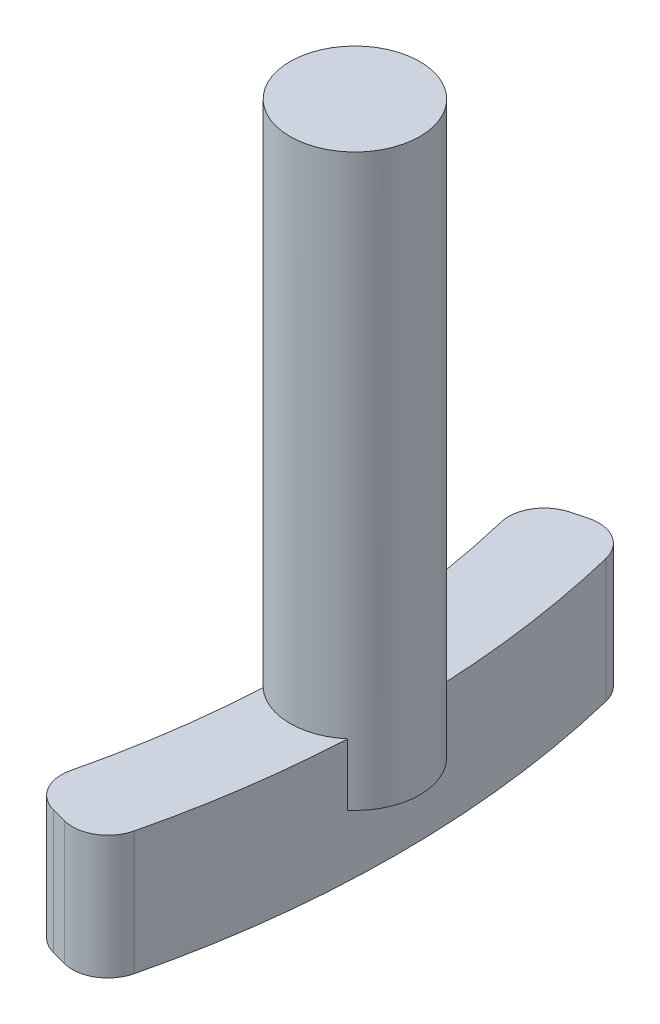
ISO-10303-21;
HEADER;
FILE_DESCRIPTION(('STEP AP214'),'2;1');
FILE_NAME('part.step','',(''),(''),'','','');
FILE_SCHEMA(('AUTOMOTIVE_DESIGN { 1 0 10303 214 1 1 1 1 }'));
ENDSEC;
DATA;
#1=APPLICATION_CONTEXT('core data for automotive mechanical design processes');
#2=APPLICATION_PROTOCOL_DEFINITION('international standard','automotive_design',2000,#1);
#3=PRODUCT_CONTEXT('',#1,'mechanical');
#4=PRODUCT('Part','Part','',(#3));
#5=PRODUCT_RELATED_PRODUCT_CATEGORY('part','',(#4));
#6=PRODUCT_DEFINITION_FORMATION('','',#4);
#7=PRODUCT_DEFINITION_CONTEXT('part definition',#1,'design');
#8=PRODUCT_DEFINITION('design','',#6,#7);
#9=PRODUCT_DEFINITION_SHAPE('','',#8);
#10=(LENGTH_UNIT() NAMED_UNIT(*) SI_UNIT(.MILLI.,.METRE.));
#11=(NAMED_UNIT(*) PLANE_ANGLE_UNIT() SI_UNIT($,.RADIAN.));
#12=(NAMED_UNIT(*) SI_UNIT($,.STERADIAN.) SOLID_ANGLE_UNIT());
#13=UNCERTAINTY_MEASURE_WITH_UNIT(LENGTH_MEASURE(1.E-05),#10,'distance_accuracy_value','');
#14=(GEOMETRIC_REPRESENTATION_CONTEXT(3) GLOBAL_UNCERTAINTY_ASSIGNED_CONTEXT((#13)) GLOBAL_UNIT_ASSIGNED_CONTEXT((#10,
#11,#12)) REPRESENTATION_CONTEXT('',''));
#15=CARTESIAN_POINT('',(0.,0.,0.));
#16=DIRECTION('',(0.,0.,1.));
#17=DIRECTION('',(1.,0.,0.));
#18=AXIS2_PLACEMENT_3D('',#15,#16,#17);
#19=CARTESIAN_POINT('',(-30.5687487202427,4.,-6.82173660494919E-13));
#20=DIRECTION('',(0.,-1.,0.));
#21=DIRECTION('',(0.,0.,-1.));
#22=AXIS2_PLACEMENT_3D('',#19,#20,#21);
#23=CYLINDRICAL_SURFACE('',#22,32.3999999999997);
#24=DIRECTION('',(0.,-1.,0.));
#25=VECTOR('',#24,1.);
#26=CARTESIAN_POINT('',(1.79173515072469,11.22,1.59971361088078));
#27=LINE('',#26,#25);
#28=CARTESIAN_POINT('',(1.79173515072469,4.,1.59971361088077));
#29=VERTEX_POINT('',#28);
#30=CARTESIAN_POINT('',(1.79173515072469,2.,1.59971361088078));
#31=VERTEX_POINT('',#30);
#32=EDGE_CURVE('E201',#29,#31,#27,.T.);
#33=ORIENTED_EDGE('',*,*,#32,.F.);
#34=CARTESIAN_POINT('',(-30.5687487202427,4.,-6.82173660494919E-13));
#35=DIRECTION('',(0.,1.,0.));
#36=DIRECTION('',(0.,0.,1.));
#37=AXIS2_PLACEMENT_3D('',#34,#35,#36);
#38=CIRCLE('',#37,32.3999999999997);
#39=CARTESIAN_POINT('',(0.919491195643052,4.,7.63221769864987));
#40=VERTEX_POINT('',#39);
#41=EDGE_CURVE('E190',#40,#29,#38,.T.);
#42=ORIENTED_EDGE('',*,*,#41,.F.);
#43=DIRECTION('',(0.,-1.,0.));
#44=VECTOR('',#43,1.);
#45=CARTESIAN_POINT('',(0.919491195643052,4.,7.63221769864987));
#46=LINE('',#45,#44);
#47=CARTESIAN_POINT('',(0.919491195643052,0.,7.63221769864987));
#48=VERTEX_POINT('',#47);
#49=EDGE_CURVE('E151',#40,#48,#46,.T.);
#50=ORIENTED_EDGE('',*,*,#49,.T.);
#51=CARTESIAN_POINT('',(-30.5687487202427,0.,-6.82173660494919E-13));
#52=DIRECTION('',(0.,1.,0.));
#53=DIRECTION('',(0.,0.,1.));
#54=AXIS2_PLACEMENT_3D('',#51,#52,#53);
#55=CIRCLE('',#54,32.3999999999997);
#56=CARTESIAN_POINT('',(0.919491195642906,0.,-7.63221769865215));
#57=VERTEX_POINT('',#56);
#58=EDGE_CURVE('E176',#48,#57,#55,.T.);
#59=ORIENTED_EDGE('',*,*,#58,.T.);
#60=DIRECTION('',(0.,-1.,0.));
#61=VECTOR('',#60,1.);
#62=CARTESIAN_POINT('',(0.919491195642906,4.,-7.63221769865215));
#63=LINE('',#62,#61);
#64=CARTESIAN_POINT('',(0.919491195642906,4.,-7.63221769865215));
#65=VERTEX_POINT('',#64);
#66=EDGE_CURVE('E154',#65,#57,#63,.T.);
#67=ORIENTED_EDGE('',*,*,#66,.F.);
#68=CARTESIAN_POINT('',(1.79173515072477,4.,-1.59971361088071));
#69=VERTEX_POINT('',#68);
#70=EDGE_CURVE('E193',#69,#65,#38,.T.);
#71=ORIENTED_EDGE('',*,*,#70,.F.);
#72=DIRECTION('',(0.,-1.,0.));
#73=VECTOR('',#72,1.);
#74=CARTESIAN_POINT('',(1.79173515072477,11.22,-1.59971361088071));
#75=LINE('',#74,#73);
#76=CARTESIAN_POINT('',(1.79173515072476,2.,-1.59971361088072));
#77=VERTEX_POINT('',#76);
#78=EDGE_CURVE('E48',#77,#69,#75,.F.);
#79=ORIENTED_EDGE('',*,*,#78,.F.);
#80=CARTESIAN_POINT('',(-30.5687487202427,2.,-6.82173660494919E-13));
#81=DIRECTION('',(0.,1.,0.));
#82=DIRECTION('',(0.,0.,1.));
#83=AXIS2_PLACEMENT_3D('',#80,#81,#82);
#84=CIRCLE('',#83,32.3999999999997);
#85=EDGE_CURVE('E52',#31,#77,#84,.T.);
#86=ORIENTED_EDGE('',*,*,#85,.F.);
#87=EDGE_LOOP('',(#33,#42,#50,#59,#67,#71,#79,#86));
#88=FACE_BOUND('',#87,.T.);
#89=ADVANCED_FACE('F33',(#88),#23,.T.);
#90=CARTESIAN_POINT('',(-30.5687487202427,4.,-6.82173660494919E-13));
#91=DIRECTION('',(0.,-1.,0.));
#92=DIRECTION('',(0.,0.,-1.));
#93=AXIS2_PLACEMENT_3D('',#90,#91,#92);
#94=CYLINDRICAL_SURFACE('',#93,29.5999999999999);
#95=DIRECTION('',(0.,-1.,0.));
#96=VECTOR('',#95,1.);
#97=CARTESIAN_POINT('',(-1.00826484927511,11.22,1.52898440615198));
#98=LINE('',#97,#96);
#99=CARTESIAN_POINT('',(-1.00826484927514,2.,1.52898440615195));
#100=VERTEX_POINT('',#99);
#101=CARTESIAN_POINT('',(-1.00826484927514,4.,1.52898440615202));
#102=VERTEX_POINT('',#101);
#103=EDGE_CURVE('E203',#100,#102,#98,.F.);
#104=ORIENTED_EDGE('',*,*,#103,.F.);
#105=CARTESIAN_POINT('',(-30.5687487202427,2.,-6.82173660494919E-13));
#106=DIRECTION('',(0.,1.,0.));
#107=DIRECTION('',(0.,0.,1.));
#108=AXIS2_PLACEMENT_3D('',#105,#106,#107);
#109=CIRCLE('',#108,29.5999999999999);
#110=CARTESIAN_POINT('',(-1.00826484927507,2.,-1.52898440615202));
#111=VERTEX_POINT('',#110);
#112=EDGE_CURVE('E11',#111,#100,#109,.F.);
#113=ORIENTED_EDGE('',*,*,#112,.F.);
#114=DIRECTION('',(0.,-1.,0.));
#115=VECTOR('',#114,1.);
#116=CARTESIAN_POINT('',(-1.00826484927504,11.22,-1.52898440615205));
#117=LINE('',#116,#115);
#118=CARTESIAN_POINT('',(-1.00826484927508,4.,-1.52898440615208));
#119=VERTEX_POINT('',#118);
#120=EDGE_CURVE('E134',#119,#111,#117,.T.);
#121=ORIENTED_EDGE('',*,*,#120,.F.);
#122=CARTESIAN_POINT('',(-30.5687487202427,4.,-6.82173660494919E-13));
#123=DIRECTION('',(0.,-1.,0.));
#124=DIRECTION('',(0.,0.,1.));
#125=AXIS2_PLACEMENT_3D('',#122,#123,#124);
#126=CIRCLE('',#125,29.5999999999999);
#127=CARTESIAN_POINT('',(-1.79899508647445,4.,-6.9614133516316));
#128=VERTEX_POINT('',#127);
#129=EDGE_CURVE('E120',#128,#119,#126,.T.);
#130=ORIENTED_EDGE('',*,*,#129,.F.);
#131=DIRECTION('',(0.,-1.,0.));
#132=VECTOR('',#131,1.);
#133=CARTESIAN_POINT('',(-1.79899508647445,4.,-6.9614133516316));
#134=LINE('',#133,#132);
#135=CARTESIAN_POINT('',(-1.79899508647445,0.,-6.9614133516316));
#136=VERTEX_POINT('',#135);
#137=EDGE_CURVE('E163',#128,#136,#134,.T.);
#138=ORIENTED_EDGE('',*,*,#137,.T.);
#139=CARTESIAN_POINT('',(-30.5687487202427,0.,-6.82173660494919E-13));
#140=DIRECTION('',(0.,-1.,0.));
#141=DIRECTION('',(0.,0.,1.));
#142=AXIS2_PLACEMENT_3D('',#139,#140,#141);
#143=CIRCLE('',#142,29.5999999999999);
#144=CARTESIAN_POINT('',(-1.79899508647446,0.,6.96141335163061));
#145=VERTEX_POINT('',#144);
#146=EDGE_CURVE('E167',#136,#145,#143,.T.);
#147=ORIENTED_EDGE('',*,*,#146,.T.);
#148=DIRECTION('',(0.,-1.,0.));
#149=VECTOR('',#148,1.);
#150=CARTESIAN_POINT('',(-1.79899508647446,4.,6.96141335163061));
#151=LINE('',#150,#149);
#152=CARTESIAN_POINT('',(-1.79899508647446,4.,6.96141335163061));
#153=VERTEX_POINT('',#152);
#154=EDGE_CURVE('E130',#153,#145,#151,.T.);
#155=ORIENTED_EDGE('',*,*,#154,.F.);
#156=EDGE_CURVE('E131',#102,#153,#126,.T.);
#157=ORIENTED_EDGE('',*,*,#156,.F.);
#158=EDGE_LOOP('',(#104,#113,#121,#130,#138,#147,#155,#157));
#159=FACE_BOUND('',#158,.T.);
#160=ADVANCED_FACE('F135',(#159),#94,.F.);
#161=CARTESIAN_POINT('',(-0.681251279757298,4.,7.23187366765677));
#162=DIRECTION('',(0.,-1.,0.));
#163=DIRECTION('',(0.,0.,-1.));
#164=AXIS2_PLACEMENT_3D('',#161,#162,#163);
#165=PLANE('',#164);
#166=CARTESIAN_POINT('',(0.431251279757166,4.,0.));
#167=DIRECTION('',(0.,-1.,0.));
#168=DIRECTION('',(0.,0.,-1.));
#169=AXIS2_PLACEMENT_3D('',#166,#167,#168);
#170=CIRCLE('',#169,2.1);
#171=EDGE_CURVE('E41',#102,#29,#170,.F.);
#172=ORIENTED_EDGE('',*,*,#171,.F.);
#173=ORIENTED_EDGE('',*,*,#156,.T.);
#174=CARTESIAN_POINT('',(-0.681251279757298,4.,7.23187366765677));
#175=DIRECTION('',(0.,1.,0.));
#176=DIRECTION('',(0.,0.,-1.));
#177=AXIS2_PLACEMENT_3D('',#174,#175,#176);
#178=CIRCLE('',#177,1.14999999999973);
#179=CARTESIAN_POINT('',(-0.97889318162474,4.,8.34268836788904));
#180=VERTEX_POINT('',#179);
#181=EDGE_CURVE('E169',#153,#180,#178,.T.);
#182=ORIENTED_EDGE('',*,*,#181,.T.);
#183=DIRECTION('',(0.965925826289159,0.,0.258819045102184));
#184=VECTOR('',#183,1.);
#185=CARTESIAN_POINT('',(-0.97889318162474,4.,8.34268836788904));
#186=LINE('',#185,#184);
#187=CARTESIAN_POINT('',(-0.495788851387267,4.,8.47213578303597));
#188=VERTEX_POINT('',#187);
#189=EDGE_CURVE('E196',#180,#188,#186,.T.);
#190=ORIENTED_EDGE('',*,*,#189,.T.);
#191=CARTESIAN_POINT('',(-0.198146949520289,4.,7.36132108280253));
#192=DIRECTION('',(0.,1.,0.));
#193=DIRECTION('',(0.,0.,-1.));
#194=AXIS2_PLACEMENT_3D('',#191,#192,#193);
#195=CIRCLE('',#194,1.15000000000074);
#196=EDGE_CURVE('E194',#188,#40,#195,.T.);
#197=ORIENTED_EDGE('',*,*,#196,.T.);
#198=ORIENTED_EDGE('',*,*,#41,.T.);
#199=EDGE_LOOP('',(#172,#173,#182,#190,#197,#198));
#200=FACE_BOUND('',#199,.T.);
#201=ADVANCED_FACE('F232',(#200),#165,.F.);
#202=CARTESIAN_POINT('',(-0.681251279757298,4.,7.23187366765677));
#203=DIRECTION('',(0.,-1.,0.));
#204=DIRECTION('',(0.,0.,-1.));
#205=AXIS2_PLACEMENT_3D('',#202,#203,#204);
#206=CYLINDRICAL_SURFACE('',#205,1.14999999999973);
#207=CARTESIAN_POINT('',(-0.681251279757298,0.,7.23187366765677));
#208=DIRECTION('',(0.,1.,0.));
#209=DIRECTION('',(0.,0.,-1.));
#210=AXIS2_PLACEMENT_3D('',#207,#208,#209);
#211=CIRCLE('',#210,1.14999999999973);
#212=CARTESIAN_POINT('',(-0.97889318162474,0.,8.34268836788904));
#213=VERTEX_POINT('',#212);
#214=EDGE_CURVE('E182',#145,#213,#211,.T.);
#215=ORIENTED_EDGE('',*,*,#214,.T.);
#216=DIRECTION('',(0.,-1.,0.));
#217=VECTOR('',#216,1.);
#218=CARTESIAN_POINT('',(-0.97889318162474,4.,8.34268836788904));
#219=LINE('',#218,#217);
#220=EDGE_CURVE('E144',#180,#213,#219,.T.);
#221=ORIENTED_EDGE('',*,*,#220,.F.);
#222=ORIENTED_EDGE('',*,*,#181,.F.);
#223=ORIENTED_EDGE('',*,*,#154,.T.);
#224=EDGE_LOOP('',(#215,#221,#222,#223));
#225=FACE_BOUND('',#224,.T.);
#226=ADVANCED_FACE('F35',(#225),#206,.T.);
#227=CARTESIAN_POINT('',(-0.97889318162474,4.,8.34268836788904));
#228=DIRECTION('',(0.258819045102184,0.,-0.965925826289159));
#229=DIRECTION('',(-0.965925826289159,0.,-0.258819045102184));
#230=AXIS2_PLACEMENT_3D('',#227,#228,#229);
#231=PLANE('',#230);
#232=DIRECTION('',(0.965925826289159,0.,0.258819045102184));
#233=VECTOR('',#232,1.);
#234=CARTESIAN_POINT('',(-0.97889318162474,0.,8.34268836788904));
#235=LINE('',#234,#233);
#236=CARTESIAN_POINT('',(-0.495788851387267,0.,8.47213578303597));
#237=VERTEX_POINT('',#236);
#238=EDGE_CURVE('E180',#213,#237,#235,.T.);
#239=ORIENTED_EDGE('',*,*,#238,.T.);
#240=DIRECTION('',(0.,-1.,0.));
#241=VECTOR('',#240,1.);
#242=CARTESIAN_POINT('',(-0.495788851387267,4.,8.47213578303597));
#243=LINE('',#242,#241);
#244=EDGE_CURVE('E146',#188,#237,#243,.T.);
#245=ORIENTED_EDGE('',*,*,#244,.F.);
#246=ORIENTED_EDGE('',*,*,#189,.F.);
#247=ORIENTED_EDGE('',*,*,#220,.T.);
#248=EDGE_LOOP('',(#239,#245,#246,#247));
#249=FACE_BOUND('',#248,.T.);
#250=ADVANCED_FACE('F240',(#249),#231,.F.);
#251=CARTESIAN_POINT('',(-0.198146949520289,4.,7.36132108280253));
#252=DIRECTION('',(0.,-1.,0.));
#253=DIRECTION('',(0.,0.,-1.));
#254=AXIS2_PLACEMENT_3D('',#251,#252,#253);
#255=CYLINDRICAL_SURFACE('',#254,1.15000000000074);
#256=CARTESIAN_POINT('',(-0.198146949520289,0.,7.36132108280253));
#257=DIRECTION('',(0.,1.,0.));
#258=DIRECTION('',(0.,0.,-1.));
#259=AXIS2_PLACEMENT_3D('',#256,#257,#258);
#260=CIRCLE('',#259,1.15000000000074);
#261=EDGE_CURVE('E178',#237,#48,#260,.T.);
#262=ORIENTED_EDGE('',*,*,#261,.T.);
#263=ORIENTED_EDGE('',*,*,#49,.F.);
#264=ORIENTED_EDGE('',*,*,#196,.F.);
#265=ORIENTED_EDGE('',*,*,#244,.T.);
#266=EDGE_LOOP('',(#262,#263,#264,#265));
#267=FACE_BOUND('',#266,.T.);
#268=ADVANCED_FACE('F238',(#267),#255,.T.);
#269=CARTESIAN_POINT('',(-0.198146949519636,4.,-7.36132108280495));
#270=DIRECTION('',(0.,-1.,0.));
#271=DIRECTION('',(0.,0.,-1.));
#272=AXIS2_PLACEMENT_3D('',#269,#270,#271);
#273=CYLINDRICAL_SURFACE('',#272,1.15000000000001);
#274=CARTESIAN_POINT('',(-0.198146949519636,0.,-7.36132108280495));
#275=DIRECTION('',(0.,1.,0.));
#276=DIRECTION('',(0.,0.,-1.));
#277=AXIS2_PLACEMENT_3D('',#274,#275,#276);
#278=CIRCLE('',#277,1.15000000000001);
#279=CARTESIAN_POINT('',(-0.495788851387536,0.,-8.47213578303739));
#280=VERTEX_POINT('',#279);
#281=EDGE_CURVE('E174',#57,#280,#278,.T.);
#282=ORIENTED_EDGE('',*,*,#281,.T.);
#283=DIRECTION('',(0.,-1.,0.));
#284=VECTOR('',#283,1.);
#285=CARTESIAN_POINT('',(-0.495788851387536,4.,-8.47213578303739));
#286=LINE('',#285,#284);
#287=CARTESIAN_POINT('',(-0.495788851387536,4.,-8.47213578303739));
#288=VERTEX_POINT('',#287);
#289=EDGE_CURVE('E157',#288,#280,#286,.T.);
#290=ORIENTED_EDGE('',*,*,#289,.F.);
#291=CARTESIAN_POINT('',(-0.198146949519636,4.,-7.36132108280495));
#292=DIRECTION('',(0.,1.,0.));
#293=DIRECTION('',(0.,0.,-1.));
#294=AXIS2_PLACEMENT_3D('',#291,#292,#293);
#295=CIRCLE('',#294,1.15000000000001);
#296=EDGE_CURVE('E188',#65,#288,#295,.T.);
#297=ORIENTED_EDGE('',*,*,#296,.F.);
#298=ORIENTED_EDGE('',*,*,#66,.T.);
#299=EDGE_LOOP('',(#282,#290,#297,#298));
#300=FACE_BOUND('',#299,.T.);
#301=ADVANCED_FACE('F236',(#300),#273,.T.);
#302=CARTESIAN_POINT('',(-0.978893181625002,4.,-8.34268836789027));
#303=DIRECTION('',(0.25881904510253,0.,0.965925826289066));
#304=DIRECTION('',(0.965925826289066,0.,-0.25881904510253));
#305=AXIS2_PLACEMENT_3D('',#302,#303,#304);
#306=PLANE('',#305);
#307=DIRECTION('',(-0.965925826289066,0.,0.25881904510253));
#308=VECTOR('',#307,1.);
#309=CARTESIAN_POINT('',(-0.978893181625002,0.,-8.34268836789027));
#310=LINE('',#309,#308);
#311=CARTESIAN_POINT('',(-0.978893181625002,0.,-8.34268836789027));
#312=VERTEX_POINT('',#311);
#313=EDGE_CURVE('E172',#280,#312,#310,.T.);
#314=ORIENTED_EDGE('',*,*,#313,.T.);
#315=DIRECTION('',(0.,-1.,0.));
#316=VECTOR('',#315,1.);
#317=CARTESIAN_POINT('',(-0.978893181625002,4.,-8.34268836789027));
#318=LINE('',#317,#316);
#319=CARTESIAN_POINT('',(-0.978893181625002,4.,-8.34268836789027));
#320=VERTEX_POINT('',#319);
#321=EDGE_CURVE('E160',#320,#312,#318,.T.);
#322=ORIENTED_EDGE('',*,*,#321,.F.);
#323=DIRECTION('',(-0.965925826289066,0.,0.25881904510253));
#324=VECTOR('',#323,1.);
#325=CARTESIAN_POINT('',(-0.978893181625002,4.,-8.34268836789027));
#326=LINE('',#325,#324);
#327=EDGE_CURVE('E186',#288,#320,#326,.T.);
#328=ORIENTED_EDGE('',*,*,#327,.F.);
#329=ORIENTED_EDGE('',*,*,#289,.T.);
#330=EDGE_LOOP('',(#314,#322,#328,#329));
#331=FACE_BOUND('',#330,.T.);
#332=ADVANCED_FACE('F267',(#331),#306,.F.);
#333=CARTESIAN_POINT('',(-0.681251279757095,4.,-7.23187366765784));
#334=DIRECTION('',(0.,-1.,0.));
#335=DIRECTION('',(0.,0.,-1.));
#336=AXIS2_PLACEMENT_3D('',#333,#334,#335);
#337=CYLINDRICAL_SURFACE('',#336,1.15);
#338=CARTESIAN_POINT('',(-0.681251279757095,0.,-7.23187366765784));
#339=DIRECTION('',(0.,1.,0.));
#340=DIRECTION('',(0.,0.,1.));
#341=AXIS2_PLACEMENT_3D('',#338,#339,#340);
#342=CIRCLE('',#341,1.15);
#343=EDGE_CURVE('E170',#312,#136,#342,.T.);
#344=ORIENTED_EDGE('',*,*,#343,.T.);
#345=ORIENTED_EDGE('',*,*,#137,.F.);
#346=CARTESIAN_POINT('',(-0.681251279757095,4.,-7.23187366765784));
#347=DIRECTION('',(0.,1.,0.));
#348=DIRECTION('',(0.,0.,1.));
#349=AXIS2_PLACEMENT_3D('',#346,#347,#348);
#350=CIRCLE('',#349,1.15);
#351=EDGE_CURVE('E126',#320,#128,#350,.T.);
#352=ORIENTED_EDGE('',*,*,#351,.F.);
#353=ORIENTED_EDGE('',*,*,#321,.T.);
#354=EDGE_LOOP('',(#344,#345,#352,#353));
#355=FACE_BOUND('',#354,.T.);
#356=ADVANCED_FACE('F270',(#355),#337,.T.);
#357=EDGE_CURVE('E124',#69,#119,#170,.F.);
#358=ORIENTED_EDGE('',*,*,#357,.F.);
#359=ORIENTED_EDGE('',*,*,#70,.T.);
#360=ORIENTED_EDGE('',*,*,#296,.T.);
#361=ORIENTED_EDGE('',*,*,#327,.T.);
#362=ORIENTED_EDGE('',*,*,#351,.T.);
#363=ORIENTED_EDGE('',*,*,#129,.T.);
#364=EDGE_LOOP('',(#358,#359,#360,#361,#362,#363));
#365=FACE_BOUND('',#364,.T.);
#366=ADVANCED_FACE('F122',(#365),#165,.F.);
#367=CARTESIAN_POINT('',(-0.681251279757298,0.,7.23187366765677));
#368=DIRECTION('',(0.,-1.,0.));
#369=DIRECTION('',(0.,0.,-1.));
#370=AXIS2_PLACEMENT_3D('',#367,#368,#369);
#371=PLANE('',#370);
#372=ORIENTED_EDGE('',*,*,#214,.F.);
#373=ORIENTED_EDGE('',*,*,#146,.F.);
#374=ORIENTED_EDGE('',*,*,#343,.F.);
#375=ORIENTED_EDGE('',*,*,#313,.F.);
#376=ORIENTED_EDGE('',*,*,#281,.F.);
#377=ORIENTED_EDGE('',*,*,#58,.F.);
#378=ORIENTED_EDGE('',*,*,#261,.F.);
#379=ORIENTED_EDGE('',*,*,#238,.F.);
#380=EDGE_LOOP('',(#372,#373,#374,#375,#376,#377,#378,#379));
#381=FACE_BOUND('',#380,.T.);
#382=ADVANCED_FACE('F256',(#381),#371,.T.);
#383=CARTESIAN_POINT('',(0.431251279757166,2.,0.));
#384=DIRECTION('',(0.,1.,0.));
#385=DIRECTION('',(0.,0.,1.));
#386=AXIS2_PLACEMENT_3D('',#383,#384,#385);
#387=PLANE('',#386);
#388=CARTESIAN_POINT('',(0.431251279757166,2.,0.));
#389=DIRECTION('',(0.,1.,0.));
#390=DIRECTION('',(0.,0.,1.));
#391=AXIS2_PLACEMENT_3D('',#388,#389,#390);
#392=CIRCLE('',#391,2.1);
#393=EDGE_CURVE('E207',#31,#77,#392,.T.);
#394=ORIENTED_EDGE('',*,*,#393,.F.);
#395=ORIENTED_EDGE('',*,*,#85,.T.);
#396=EDGE_LOOP('',(#394,#395));
#397=FACE_BOUND('',#396,.T.);
#398=ADVANCED_FACE('F223',(#397),#387,.F.);
#399=EDGE_CURVE('E209',#111,#100,#392,.T.);
#400=ORIENTED_EDGE('',*,*,#399,.F.);
#401=ORIENTED_EDGE('',*,*,#112,.T.);
#402=EDGE_LOOP('',(#400,#401));
#403=FACE_BOUND('',#402,.T.);
#404=ADVANCED_FACE('F216',(#403),#387,.F.);
#405=CARTESIAN_POINT('',(0.431251279757166,20.44,0.));
#406=DIRECTION('',(0.,-1.,0.));
#407=DIRECTION('',(0.,0.,-1.));
#408=AXIS2_PLACEMENT_3D('',#405,#406,#407);
#409=CYLINDRICAL_SURFACE('',#408,2.1);
#410=CARTESIAN_POINT('',(0.431251279757166,20.44,0.));
#411=DIRECTION('',(0.,1.,0.));
#412=DIRECTION('',(0.,0.,1.));
#413=AXIS2_PLACEMENT_3D('',#410,#411,#412);
#414=CIRCLE('',#413,2.1);
#415=CARTESIAN_POINT('',(0.431251279757166,20.44,2.1));
#416=VERTEX_POINT('',#415);
#417=EDGE_CURVE('E139',#416,#416,#414,.T.);
#418=ORIENTED_EDGE('',*,*,#417,.F.);
#419=EDGE_LOOP('',(#418));
#420=FACE_BOUND('',#419,.T.);
#421=ORIENTED_EDGE('',*,*,#171,.T.);
#422=ORIENTED_EDGE('',*,*,#32,.T.);
#423=ORIENTED_EDGE('',*,*,#393,.T.);
#424=ORIENTED_EDGE('',*,*,#78,.T.);
#425=ORIENTED_EDGE('',*,*,#357,.T.);
#426=ORIENTED_EDGE('',*,*,#120,.T.);
#427=ORIENTED_EDGE('',*,*,#399,.T.);
#428=ORIENTED_EDGE('',*,*,#103,.T.);
#429=EDGE_LOOP('',(#421,#422,#423,#424,#425,#426,#427,#428));
#430=FACE_BOUND('',#429,.T.);
#431=ADVANCED_FACE('F142',(#420,#430),#409,.T.);
#432=CARTESIAN_POINT('',(0.431251279757166,20.44,0.));
#433=DIRECTION('',(0.,1.,0.));
#434=DIRECTION('',(0.,0.,1.));
#435=AXIS2_PLACEMENT_3D('',#432,#433,#434);
#436=PLANE('',#435);
#437=ORIENTED_EDGE('',*,*,#417,.T.);
#438=EDGE_LOOP('',(#437));
#439=FACE_BOUND('',#438,.T.);
#440=ADVANCED_FACE('F213',(#439),#436,.T.);
#441=CLOSED_SHELL('',(#89,#160,#201,#226,#250,#268,#301,#332,#356,#366,#382,#398,#404,#431,#440));
#442=MANIFOLD_SOLID_BREP('B2',#441);
#443=ADVANCED_BREP_SHAPE_REPRESENTATION('',(#18,#442),#14);
#444=SHAPE_DEFINITION_REPRESENTATION(#9,#443);
ENDSEC;
END-ISO-10303-21;
